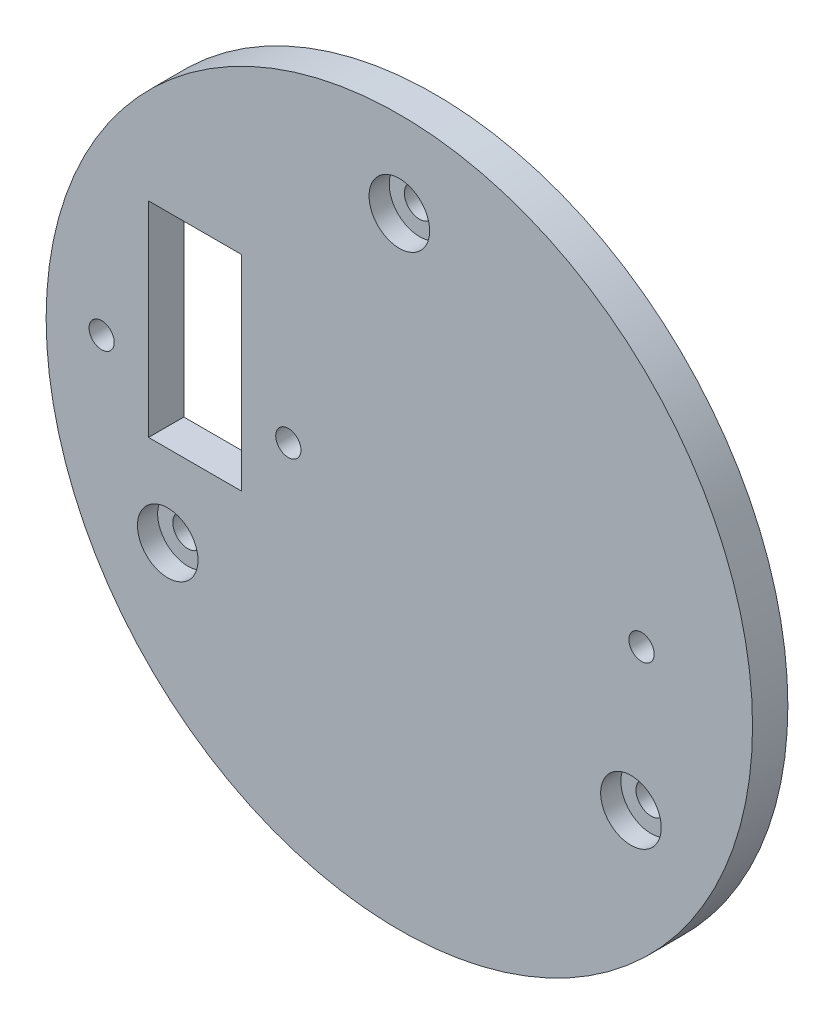
ISO-10303-21;
HEADER;
FILE_DESCRIPTION(('STEP AP214'),'2;1');
FILE_NAME('part.step','',(''),(''),'','','');
FILE_SCHEMA(('AUTOMOTIVE_DESIGN { 1 0 10303 214 1 1 1 1 }'));
ENDSEC;
DATA;
#1=APPLICATION_CONTEXT('core data for automotive mechanical design processes');
#2=APPLICATION_PROTOCOL_DEFINITION('international standard','automotive_design',2000,#1);
#3=PRODUCT_CONTEXT('',#1,'mechanical');
#4=PRODUCT('Part','Part','',(#3));
#5=PRODUCT_RELATED_PRODUCT_CATEGORY('part','',(#4));
#6=PRODUCT_DEFINITION_FORMATION('','',#4);
#7=PRODUCT_DEFINITION_CONTEXT('part definition',#1,'design');
#8=PRODUCT_DEFINITION('design','',#6,#7);
#9=PRODUCT_DEFINITION_SHAPE('','',#8);
#10=(LENGTH_UNIT() NAMED_UNIT(*) SI_UNIT(.MILLI.,.METRE.));
#11=(NAMED_UNIT(*) PLANE_ANGLE_UNIT() SI_UNIT($,.RADIAN.));
#12=(NAMED_UNIT(*) SI_UNIT($,.STERADIAN.) SOLID_ANGLE_UNIT());
#13=UNCERTAINTY_MEASURE_WITH_UNIT(LENGTH_MEASURE(1.E-05),#10,'distance_accuracy_value','');
#14=(GEOMETRIC_REPRESENTATION_CONTEXT(3) GLOBAL_UNCERTAINTY_ASSIGNED_CONTEXT((#13)) GLOBAL_UNIT_ASSIGNED_CONTEXT((#10,
#11,#12)) REPRESENTATION_CONTEXT('',''));
#15=CARTESIAN_POINT('',(0.,0.,0.));
#16=DIRECTION('',(0.,0.,1.));
#17=DIRECTION('',(1.,0.,0.));
#18=AXIS2_PLACEMENT_3D('',#15,#16,#17);
#19=CARTESIAN_POINT('',(0.,0.,3.5));
#20=DIRECTION('',(0.,0.,-1.));
#21=DIRECTION('',(-1.,0.,0.));
#22=AXIS2_PLACEMENT_3D('',#19,#20,#21);
#23=CYLINDRICAL_SURFACE('',#22,35.);
#24=CARTESIAN_POINT('',(0.,0.,3.5));
#25=DIRECTION('',(0.,0.,1.));
#26=DIRECTION('',(1.,0.,0.));
#27=AXIS2_PLACEMENT_3D('',#24,#25,#26);
#28=CIRCLE('',#27,35.);
#29=CARTESIAN_POINT('',(35.,0.,3.5));
#30=VERTEX_POINT('',#29);
#31=EDGE_CURVE('E11',#30,#30,#28,.T.);
#32=ORIENTED_EDGE('',*,*,#31,.F.);
#33=EDGE_LOOP('',(#32));
#34=FACE_BOUND('',#33,.T.);
#35=CARTESIAN_POINT('',(0.,0.,0.));
#36=DIRECTION('',(0.,0.,1.));
#37=DIRECTION('',(1.,0.,0.));
#38=AXIS2_PLACEMENT_3D('',#35,#36,#37);
#39=CIRCLE('',#38,35.);
#40=CARTESIAN_POINT('',(35.,0.,0.));
#41=VERTEX_POINT('',#40);
#42=EDGE_CURVE('E46',#41,#41,#39,.T.);
#43=ORIENTED_EDGE('',*,*,#42,.T.);
#44=EDGE_LOOP('',(#43));
#45=FACE_BOUND('',#44,.T.);
#46=ADVANCED_FACE('F38',(#34,#45),#23,.T.);
#47=CARTESIAN_POINT('',(0.,0.,3.5));
#48=DIRECTION('',(0.,0.,1.));
#49=DIRECTION('',(1.,0.,0.));
#50=AXIS2_PLACEMENT_3D('',#47,#48,#49);
#51=PLANE('',#50);
#52=DIRECTION('',(0.,1.,0.));
#53=VECTOR('',#52,1.);
#54=CARTESIAN_POINT('',(-15.65,0.,3.5));
#55=LINE('',#54,#53);
#56=CARTESIAN_POINT('',(-15.65,-5.15,3.5));
#57=VERTEX_POINT('',#56);
#58=CARTESIAN_POINT('',(-15.65,15.15,3.5));
#59=VERTEX_POINT('',#58);
#60=EDGE_CURVE('E113',#57,#59,#55,.T.);
#61=ORIENTED_EDGE('',*,*,#60,.F.);
#62=DIRECTION('',(1.,0.,0.));
#63=VECTOR('',#62,1.);
#64=CARTESIAN_POINT('',(0.,-5.15,3.5));
#65=LINE('',#64,#63);
#66=CARTESIAN_POINT('',(-24.85,-5.15,3.5));
#67=VERTEX_POINT('',#66);
#68=EDGE_CURVE('E106',#67,#57,#65,.T.);
#69=ORIENTED_EDGE('',*,*,#68,.F.);
#70=DIRECTION('',(0.,-1.,0.));
#71=VECTOR('',#70,1.);
#72=CARTESIAN_POINT('',(-24.85,0.,3.5));
#73=LINE('',#72,#71);
#74=CARTESIAN_POINT('',(-24.85,15.15,3.5));
#75=VERTEX_POINT('',#74);
#76=EDGE_CURVE('E86',#75,#67,#73,.T.);
#77=ORIENTED_EDGE('',*,*,#76,.F.);
#78=DIRECTION('',(-1.,0.,0.));
#79=VECTOR('',#78,1.);
#80=CARTESIAN_POINT('',(0.,15.15,3.5));
#81=LINE('',#80,#79);
#82=EDGE_CURVE('E111',#59,#75,#81,.T.);
#83=ORIENTED_EDGE('',*,*,#82,.F.);
#84=EDGE_LOOP('',(#61,#69,#77,#83));
#85=FACE_BOUND('',#84,.T.);
#86=CARTESIAN_POINT('',(24.,1.29999999999999,3.5));
#87=DIRECTION('',(0.,0.,-1.));
#88=DIRECTION('',(-1.,0.,0.));
#89=AXIS2_PLACEMENT_3D('',#86,#87,#88);
#90=CIRCLE('',#89,1.25);
#91=CARTESIAN_POINT('',(22.75,1.29999999999999,3.5));
#92=VERTEX_POINT('',#91);
#93=EDGE_CURVE('E116',#92,#92,#90,.T.);
#94=ORIENTED_EDGE('',*,*,#93,.T.);
#95=EDGE_LOOP('',(#94));
#96=FACE_BOUND('',#95,.T.);
#97=CARTESIAN_POINT('',(-11.,1.3,3.5));
#98=DIRECTION('',(0.,0.,-1.));
#99=DIRECTION('',(-1.,0.,0.));
#100=AXIS2_PLACEMENT_3D('',#97,#98,#99);
#101=CIRCLE('',#100,1.25);
#102=CARTESIAN_POINT('',(-12.25,1.3,3.5));
#103=VERTEX_POINT('',#102);
#104=EDGE_CURVE('E123',#103,#103,#101,.T.);
#105=ORIENTED_EDGE('',*,*,#104,.T.);
#106=EDGE_LOOP('',(#105));
#107=FACE_BOUND('',#106,.T.);
#108=CARTESIAN_POINT('',(-29.5,1.3,3.5));
#109=DIRECTION('',(0.,0.,-1.));
#110=DIRECTION('',(-1.,0.,0.));
#111=AXIS2_PLACEMENT_3D('',#108,#109,#110);
#112=CIRCLE('',#111,1.25);
#113=CARTESIAN_POINT('',(-30.75,1.3,3.5));
#114=VERTEX_POINT('',#113);
#115=EDGE_CURVE('E129',#114,#114,#112,.T.);
#116=ORIENTED_EDGE('',*,*,#115,.T.);
#117=EDGE_LOOP('',(#116));
#118=FACE_BOUND('',#117,.T.);
#119=CARTESIAN_POINT('',(0.,26.5,3.5));
#120=DIRECTION('',(0.,0.,1.));
#121=DIRECTION('',(1.,0.,0.));
#122=AXIS2_PLACEMENT_3D('',#119,#120,#121);
#123=CIRCLE('',#122,3.);
#124=CARTESIAN_POINT('',(3.,26.5,3.5));
#125=VERTEX_POINT('',#124);
#126=EDGE_CURVE('E146',#125,#125,#123,.T.);
#127=ORIENTED_EDGE('',*,*,#126,.F.);
#128=EDGE_LOOP('',(#127));
#129=FACE_BOUND('',#128,.T.);
#130=CARTESIAN_POINT('',(22.9496732002893,-13.249999999999,3.5));
#131=DIRECTION('',(0.,0.,1.));
#132=DIRECTION('',(1.,0.,0.));
#133=AXIS2_PLACEMENT_3D('',#130,#131,#132);
#134=CIRCLE('',#133,3.00000000000146);
#135=CARTESIAN_POINT('',(25.9496732002908,-13.249999999999,3.5));
#136=VERTEX_POINT('',#135);
#137=EDGE_CURVE('E152',#136,#136,#134,.T.);
#138=ORIENTED_EDGE('',*,*,#137,.F.);
#139=EDGE_LOOP('',(#138));
#140=FACE_BOUND('',#139,.T.);
#141=CARTESIAN_POINT('',(-22.9496732002859,-13.250000000001,3.5));
#142=DIRECTION('',(0.,0.,1.));
#143=DIRECTION('',(1.,0.,0.));
#144=AXIS2_PLACEMENT_3D('',#141,#142,#143);
#145=CIRCLE('',#144,3.00000000000214);
#146=CARTESIAN_POINT('',(-19.9496732002838,-13.250000000001,3.5));
#147=VERTEX_POINT('',#146);
#148=EDGE_CURVE('E158',#147,#147,#145,.T.);
#149=ORIENTED_EDGE('',*,*,#148,.F.);
#150=EDGE_LOOP('',(#149));
#151=FACE_BOUND('',#150,.T.);
#152=ORIENTED_EDGE('',*,*,#31,.T.);
#153=EDGE_LOOP('',(#152));
#154=FACE_BOUND('',#153,.T.);
#155=ADVANCED_FACE('F187',(#85,#96,#107,#118,#129,#140,#151,#154),#51,.T.);
#156=CARTESIAN_POINT('',(0.,0.,0.));
#157=DIRECTION('',(0.,0.,1.));
#158=DIRECTION('',(1.,0.,0.));
#159=AXIS2_PLACEMENT_3D('',#156,#157,#158);
#160=PLANE('',#159);
#161=DIRECTION('',(-1.,0.,0.));
#162=VECTOR('',#161,1.);
#163=CARTESIAN_POINT('',(-15.65,-5.15,0.));
#164=LINE('',#163,#162);
#165=CARTESIAN_POINT('',(-15.65,-5.15,0.));
#166=VERTEX_POINT('',#165);
#167=CARTESIAN_POINT('',(-24.85,-5.15,0.));
#168=VERTEX_POINT('',#167);
#169=EDGE_CURVE('E92',#166,#168,#164,.T.);
#170=ORIENTED_EDGE('',*,*,#169,.F.);
#171=DIRECTION('',(0.,-1.,0.));
#172=VECTOR('',#171,1.);
#173=CARTESIAN_POINT('',(-15.65,15.15,0.));
#174=LINE('',#173,#172);
#175=CARTESIAN_POINT('',(-15.65,15.15,0.));
#176=VERTEX_POINT('',#175);
#177=EDGE_CURVE('E62',#176,#166,#174,.T.);
#178=ORIENTED_EDGE('',*,*,#177,.F.);
#179=DIRECTION('',(1.,0.,0.));
#180=VECTOR('',#179,1.);
#181=CARTESIAN_POINT('',(-15.65,15.15,0.));
#182=LINE('',#181,#180);
#183=CARTESIAN_POINT('',(-24.85,15.15,0.));
#184=VERTEX_POINT('',#183);
#185=EDGE_CURVE('E99',#184,#176,#182,.T.);
#186=ORIENTED_EDGE('',*,*,#185,.F.);
#187=DIRECTION('',(0.,1.,0.));
#188=VECTOR('',#187,1.);
#189=CARTESIAN_POINT('',(-24.85,15.15,0.));
#190=LINE('',#189,#188);
#191=EDGE_CURVE('E83',#168,#184,#190,.T.);
#192=ORIENTED_EDGE('',*,*,#191,.F.);
#193=EDGE_LOOP('',(#170,#178,#186,#192));
#194=FACE_BOUND('',#193,.T.);
#195=CARTESIAN_POINT('',(24.,1.29999999999999,0.));
#196=DIRECTION('',(0.,0.,-1.));
#197=DIRECTION('',(-1.,0.,0.));
#198=AXIS2_PLACEMENT_3D('',#195,#196,#197);
#199=CIRCLE('',#198,1.25);
#200=CARTESIAN_POINT('',(22.75,1.29999999999999,0.));
#201=VERTEX_POINT('',#200);
#202=EDGE_CURVE('E120',#201,#201,#199,.T.);
#203=ORIENTED_EDGE('',*,*,#202,.F.);
#204=EDGE_LOOP('',(#203));
#205=FACE_BOUND('',#204,.T.);
#206=CARTESIAN_POINT('',(-11.,1.3,0.));
#207=DIRECTION('',(0.,0.,-1.));
#208=DIRECTION('',(-1.,0.,0.));
#209=AXIS2_PLACEMENT_3D('',#206,#207,#208);
#210=CIRCLE('',#209,1.25);
#211=CARTESIAN_POINT('',(-12.25,1.3,0.));
#212=VERTEX_POINT('',#211);
#213=EDGE_CURVE('E126',#212,#212,#210,.T.);
#214=ORIENTED_EDGE('',*,*,#213,.F.);
#215=EDGE_LOOP('',(#214));
#216=FACE_BOUND('',#215,.T.);
#217=CARTESIAN_POINT('',(-29.5,1.3,0.));
#218=DIRECTION('',(0.,0.,-1.));
#219=DIRECTION('',(-1.,0.,0.));
#220=AXIS2_PLACEMENT_3D('',#217,#218,#219);
#221=CIRCLE('',#220,1.25);
#222=CARTESIAN_POINT('',(-30.75,1.3,0.));
#223=VERTEX_POINT('',#222);
#224=EDGE_CURVE('E115',#223,#223,#221,.T.);
#225=ORIENTED_EDGE('',*,*,#224,.F.);
#226=EDGE_LOOP('',(#225));
#227=FACE_BOUND('',#226,.T.);
#228=CARTESIAN_POINT('',(0.,26.5,0.));
#229=DIRECTION('',(0.,0.,1.));
#230=DIRECTION('',(1.,0.,0.));
#231=AXIS2_PLACEMENT_3D('',#228,#229,#230);
#232=CIRCLE('',#231,1.5);
#233=CARTESIAN_POINT('',(1.5,26.5,0.));
#234=VERTEX_POINT('',#233);
#235=EDGE_CURVE('E134',#234,#234,#232,.T.);
#236=ORIENTED_EDGE('',*,*,#235,.T.);
#237=EDGE_LOOP('',(#236));
#238=FACE_BOUND('',#237,.T.);
#239=CARTESIAN_POINT('',(-22.9496732002859,-13.250000000001,0.));
#240=DIRECTION('',(0.,0.,1.));
#241=DIRECTION('',(1.,0.,0.));
#242=AXIS2_PLACEMENT_3D('',#239,#240,#241);
#243=CIRCLE('',#242,1.50000000000214);
#244=CARTESIAN_POINT('',(-21.4496732002838,-13.250000000001,0.));
#245=VERTEX_POINT('',#244);
#246=EDGE_CURVE('E138',#245,#245,#243,.T.);
#247=ORIENTED_EDGE('',*,*,#246,.T.);
#248=EDGE_LOOP('',(#247));
#249=FACE_BOUND('',#248,.T.);
#250=CARTESIAN_POINT('',(22.9496732002893,-13.249999999999,0.));
#251=DIRECTION('',(0.,0.,1.));
#252=DIRECTION('',(1.,0.,0.));
#253=AXIS2_PLACEMENT_3D('',#250,#251,#252);
#254=CIRCLE('',#253,1.50000000000146);
#255=CARTESIAN_POINT('',(24.4496732002908,-13.249999999999,0.));
#256=VERTEX_POINT('',#255);
#257=EDGE_CURVE('E119',#256,#256,#254,.T.);
#258=ORIENTED_EDGE('',*,*,#257,.T.);
#259=EDGE_LOOP('',(#258));
#260=FACE_BOUND('',#259,.T.);
#261=ORIENTED_EDGE('',*,*,#42,.F.);
#262=EDGE_LOOP('',(#261));
#263=FACE_BOUND('',#262,.T.);
#264=ADVANCED_FACE('F96',(#194,#205,#216,#227,#238,#249,#260,#263),#160,.F.);
#265=CARTESIAN_POINT('',(-22.9496732002859,-13.250000000001,1.5));
#266=DIRECTION('',(0.,0.,1.));
#267=DIRECTION('',(1.,0.,0.));
#268=AXIS2_PLACEMENT_3D('',#265,#266,#267);
#269=CYLINDRICAL_SURFACE('',#268,3.00000000000214);
#270=CARTESIAN_POINT('',(-22.9496732002859,-13.250000000001,1.5));
#271=DIRECTION('',(0.,0.,1.));
#272=DIRECTION('',(1.,0.,0.));
#273=AXIS2_PLACEMENT_3D('',#270,#271,#272);
#274=CIRCLE('',#273,3.00000000000214);
#275=CARTESIAN_POINT('',(-19.9496732002838,-13.250000000001,1.5));
#276=VERTEX_POINT('',#275);
#277=EDGE_CURVE('E155',#276,#276,#274,.T.);
#278=ORIENTED_EDGE('',*,*,#277,.F.);
#279=EDGE_LOOP('',(#278));
#280=FACE_BOUND('',#279,.T.);
#281=ORIENTED_EDGE('',*,*,#148,.T.);
#282=EDGE_LOOP('',(#281));
#283=FACE_BOUND('',#282,.T.);
#284=ADVANCED_FACE('F178',(#280,#283),#269,.F.);
#285=CARTESIAN_POINT('',(-22.9496732002859,-13.250000000001,1.5));
#286=DIRECTION('',(0.,0.,1.));
#287=DIRECTION('',(1.,0.,0.));
#288=AXIS2_PLACEMENT_3D('',#285,#286,#287);
#289=PLANE('',#288);
#290=CARTESIAN_POINT('',(-22.9496732002859,-13.250000000001,1.5));
#291=DIRECTION('',(0.,0.,1.));
#292=DIRECTION('',(1.,0.,0.));
#293=AXIS2_PLACEMENT_3D('',#290,#291,#292);
#294=CIRCLE('',#293,1.50000000000214);
#295=CARTESIAN_POINT('',(-21.4496732002838,-13.250000000001,1.5));
#296=VERTEX_POINT('',#295);
#297=EDGE_CURVE('E41',#296,#296,#294,.T.);
#298=ORIENTED_EDGE('',*,*,#297,.F.);
#299=EDGE_LOOP('',(#298));
#300=FACE_BOUND('',#299,.T.);
#301=ORIENTED_EDGE('',*,*,#277,.T.);
#302=EDGE_LOOP('',(#301));
#303=FACE_BOUND('',#302,.T.);
#304=ADVANCED_FACE('F174',(#300,#303),#289,.T.);
#305=CARTESIAN_POINT('',(22.9496732002893,-13.249999999999,1.5));
#306=DIRECTION('',(0.,0.,1.));
#307=DIRECTION('',(1.,0.,0.));
#308=AXIS2_PLACEMENT_3D('',#305,#306,#307);
#309=CYLINDRICAL_SURFACE('',#308,3.00000000000146);
#310=CARTESIAN_POINT('',(22.9496732002893,-13.249999999999,1.5));
#311=DIRECTION('',(0.,0.,1.));
#312=DIRECTION('',(1.,0.,0.));
#313=AXIS2_PLACEMENT_3D('',#310,#311,#312);
#314=CIRCLE('',#313,3.00000000000146);
#315=CARTESIAN_POINT('',(25.9496732002908,-13.249999999999,1.5));
#316=VERTEX_POINT('',#315);
#317=EDGE_CURVE('E149',#316,#316,#314,.T.);
#318=ORIENTED_EDGE('',*,*,#317,.F.);
#319=EDGE_LOOP('',(#318));
#320=FACE_BOUND('',#319,.T.);
#321=ORIENTED_EDGE('',*,*,#137,.T.);
#322=EDGE_LOOP('',(#321));
#323=FACE_BOUND('',#322,.T.);
#324=ADVANCED_FACE('F177',(#320,#323),#309,.F.);
#325=CARTESIAN_POINT('',(22.9496732002893,-13.249999999999,1.5));
#326=DIRECTION('',(0.,0.,1.));
#327=DIRECTION('',(1.,0.,0.));
#328=AXIS2_PLACEMENT_3D('',#325,#326,#327);
#329=PLANE('',#328);
#330=CARTESIAN_POINT('',(22.9496732002893,-13.249999999999,1.5));
#331=DIRECTION('',(0.,0.,1.));
#332=DIRECTION('',(1.,0.,0.));
#333=AXIS2_PLACEMENT_3D('',#330,#331,#332);
#334=CIRCLE('',#333,1.50000000000146);
#335=CARTESIAN_POINT('',(24.4496732002908,-13.249999999999,1.5));
#336=VERTEX_POINT('',#335);
#337=EDGE_CURVE('E164',#336,#336,#334,.T.);
#338=ORIENTED_EDGE('',*,*,#337,.F.);
#339=EDGE_LOOP('',(#338));
#340=FACE_BOUND('',#339,.T.);
#341=ORIENTED_EDGE('',*,*,#317,.T.);
#342=EDGE_LOOP('',(#341));
#343=FACE_BOUND('',#342,.T.);
#344=ADVANCED_FACE('F204',(#340,#343),#329,.T.);
#345=CARTESIAN_POINT('',(0.,26.5,1.5));
#346=DIRECTION('',(0.,0.,1.));
#347=DIRECTION('',(1.,0.,0.));
#348=AXIS2_PLACEMENT_3D('',#345,#346,#347);
#349=CYLINDRICAL_SURFACE('',#348,3.);
#350=CARTESIAN_POINT('',(0.,26.5,1.5));
#351=DIRECTION('',(0.,0.,1.));
#352=DIRECTION('',(1.,0.,0.));
#353=AXIS2_PLACEMENT_3D('',#350,#351,#352);
#354=CIRCLE('',#353,3.);
#355=CARTESIAN_POINT('',(3.,26.5,1.5));
#356=VERTEX_POINT('',#355);
#357=EDGE_CURVE('E143',#356,#356,#354,.T.);
#358=ORIENTED_EDGE('',*,*,#357,.F.);
#359=EDGE_LOOP('',(#358));
#360=FACE_BOUND('',#359,.T.);
#361=ORIENTED_EDGE('',*,*,#126,.T.);
#362=EDGE_LOOP('',(#361));
#363=FACE_BOUND('',#362,.T.);
#364=ADVANCED_FACE('F208',(#360,#363),#349,.F.);
#365=CARTESIAN_POINT('',(0.,26.5,1.5));
#366=DIRECTION('',(0.,0.,1.));
#367=DIRECTION('',(1.,0.,0.));
#368=AXIS2_PLACEMENT_3D('',#365,#366,#367);
#369=PLANE('',#368);
#370=CARTESIAN_POINT('',(0.,26.5,1.5));
#371=DIRECTION('',(0.,0.,1.));
#372=DIRECTION('',(1.,0.,0.));
#373=AXIS2_PLACEMENT_3D('',#370,#371,#372);
#374=CIRCLE('',#373,1.5);
#375=CARTESIAN_POINT('',(1.5,26.5,1.5));
#376=VERTEX_POINT('',#375);
#377=EDGE_CURVE('E137',#376,#376,#374,.T.);
#378=ORIENTED_EDGE('',*,*,#377,.F.);
#379=EDGE_LOOP('',(#378));
#380=FACE_BOUND('',#379,.T.);
#381=ORIENTED_EDGE('',*,*,#357,.T.);
#382=EDGE_LOOP('',(#381));
#383=FACE_BOUND('',#382,.T.);
#384=ADVANCED_FACE('F212',(#380,#383),#369,.T.);
#385=CARTESIAN_POINT('',(0.,26.5,0.));
#386=DIRECTION('',(0.,0.,1.));
#387=DIRECTION('',(1.,0.,0.));
#388=AXIS2_PLACEMENT_3D('',#385,#386,#387);
#389=CYLINDRICAL_SURFACE('',#388,1.5);
#390=ORIENTED_EDGE('',*,*,#377,.T.);
#391=EDGE_LOOP('',(#390));
#392=FACE_BOUND('',#391,.T.);
#393=ORIENTED_EDGE('',*,*,#235,.F.);
#394=EDGE_LOOP('',(#393));
#395=FACE_BOUND('',#394,.T.);
#396=ADVANCED_FACE('F216',(#392,#395),#389,.F.);
#397=CARTESIAN_POINT('',(22.9496732002893,-13.249999999999,0.));
#398=DIRECTION('',(0.,0.,1.));
#399=DIRECTION('',(1.,0.,0.));
#400=AXIS2_PLACEMENT_3D('',#397,#398,#399);
#401=CYLINDRICAL_SURFACE('',#400,1.50000000000146);
#402=ORIENTED_EDGE('',*,*,#337,.T.);
#403=EDGE_LOOP('',(#402));
#404=FACE_BOUND('',#403,.T.);
#405=ORIENTED_EDGE('',*,*,#257,.F.);
#406=EDGE_LOOP('',(#405));
#407=FACE_BOUND('',#406,.T.);
#408=ADVANCED_FACE('F218',(#404,#407),#401,.F.);
#409=CARTESIAN_POINT('',(-22.9496732002859,-13.250000000001,0.));
#410=DIRECTION('',(0.,0.,1.));
#411=DIRECTION('',(1.,0.,0.));
#412=AXIS2_PLACEMENT_3D('',#409,#410,#411);
#413=CYLINDRICAL_SURFACE('',#412,1.50000000000214);
#414=ORIENTED_EDGE('',*,*,#297,.T.);
#415=EDGE_LOOP('',(#414));
#416=FACE_BOUND('',#415,.T.);
#417=ORIENTED_EDGE('',*,*,#246,.F.);
#418=EDGE_LOOP('',(#417));
#419=FACE_BOUND('',#418,.T.);
#420=ADVANCED_FACE('F171',(#416,#419),#413,.F.);
#421=CARTESIAN_POINT('',(-29.5,1.3,3.5));
#422=DIRECTION('',(0.,0.,-1.));
#423=DIRECTION('',(-1.,0.,0.));
#424=AXIS2_PLACEMENT_3D('',#421,#422,#423);
#425=CYLINDRICAL_SURFACE('',#424,1.25);
#426=ORIENTED_EDGE('',*,*,#115,.F.);
#427=EDGE_LOOP('',(#426));
#428=FACE_BOUND('',#427,.T.);
#429=ORIENTED_EDGE('',*,*,#224,.T.);
#430=EDGE_LOOP('',(#429));
#431=FACE_BOUND('',#430,.T.);
#432=ADVANCED_FACE('F223',(#428,#431),#425,.F.);
#433=CARTESIAN_POINT('',(-11.,1.3,3.5));
#434=DIRECTION('',(0.,0.,-1.));
#435=DIRECTION('',(-1.,0.,0.));
#436=AXIS2_PLACEMENT_3D('',#433,#434,#435);
#437=CYLINDRICAL_SURFACE('',#436,1.25);
#438=ORIENTED_EDGE('',*,*,#104,.F.);
#439=EDGE_LOOP('',(#438));
#440=FACE_BOUND('',#439,.T.);
#441=ORIENTED_EDGE('',*,*,#213,.T.);
#442=EDGE_LOOP('',(#441));
#443=FACE_BOUND('',#442,.T.);
#444=ADVANCED_FACE('F229',(#440,#443),#437,.F.);
#445=CARTESIAN_POINT('',(24.,1.29999999999999,3.5));
#446=DIRECTION('',(0.,0.,-1.));
#447=DIRECTION('',(-1.,0.,0.));
#448=AXIS2_PLACEMENT_3D('',#445,#446,#447);
#449=CYLINDRICAL_SURFACE('',#448,1.25);
#450=ORIENTED_EDGE('',*,*,#93,.F.);
#451=EDGE_LOOP('',(#450));
#452=FACE_BOUND('',#451,.T.);
#453=ORIENTED_EDGE('',*,*,#202,.T.);
#454=EDGE_LOOP('',(#453));
#455=FACE_BOUND('',#454,.T.);
#456=ADVANCED_FACE('F233',(#452,#455),#449,.F.);
#457=CARTESIAN_POINT('',(-15.65,15.15,10.));
#458=DIRECTION('',(1.,0.,0.));
#459=DIRECTION('',(0.,0.,-1.));
#460=AXIS2_PLACEMENT_3D('',#457,#458,#459);
#461=PLANE('',#460);
#462=ORIENTED_EDGE('',*,*,#60,.T.);
#463=DIRECTION('',(0.,0.,-1.));
#464=VECTOR('',#463,1.);
#465=CARTESIAN_POINT('',(-15.65,15.15,10.));
#466=LINE('',#465,#464);
#467=EDGE_CURVE('E104',#59,#176,#466,.T.);
#468=ORIENTED_EDGE('',*,*,#467,.T.);
#469=ORIENTED_EDGE('',*,*,#177,.T.);
#470=DIRECTION('',(0.,0.,-1.));
#471=VECTOR('',#470,1.);
#472=CARTESIAN_POINT('',(-15.65,-5.15,10.));
#473=LINE('',#472,#471);
#474=EDGE_CURVE('E89',#57,#166,#473,.T.);
#475=ORIENTED_EDGE('',*,*,#474,.F.);
#476=EDGE_LOOP('',(#462,#468,#469,#475));
#477=FACE_BOUND('',#476,.T.);
#478=ADVANCED_FACE('F237',(#477),#461,.F.);
#479=CARTESIAN_POINT('',(-15.65,15.15,10.));
#480=DIRECTION('',(0.,1.,0.));
#481=DIRECTION('',(-1.,0.,0.));
#482=AXIS2_PLACEMENT_3D('',#479,#480,#481);
#483=PLANE('',#482);
#484=ORIENTED_EDGE('',*,*,#82,.T.);
#485=DIRECTION('',(0.,0.,-1.));
#486=VECTOR('',#485,1.);
#487=CARTESIAN_POINT('',(-24.85,15.15,10.));
#488=LINE('',#487,#486);
#489=EDGE_CURVE('E88',#75,#184,#488,.T.);
#490=ORIENTED_EDGE('',*,*,#489,.T.);
#491=ORIENTED_EDGE('',*,*,#185,.T.);
#492=ORIENTED_EDGE('',*,*,#467,.F.);
#493=EDGE_LOOP('',(#484,#490,#491,#492));
#494=FACE_BOUND('',#493,.T.);
#495=ADVANCED_FACE('F241',(#494),#483,.F.);
#496=CARTESIAN_POINT('',(-24.85,15.15,10.));
#497=DIRECTION('',(-1.,0.,0.));
#498=DIRECTION('',(0.,0.,1.));
#499=AXIS2_PLACEMENT_3D('',#496,#497,#498);
#500=PLANE('',#499);
#501=ORIENTED_EDGE('',*,*,#76,.T.);
#502=DIRECTION('',(0.,0.,-1.));
#503=VECTOR('',#502,1.);
#504=CARTESIAN_POINT('',(-24.85,-5.15,10.));
#505=LINE('',#504,#503);
#506=EDGE_CURVE('E54',#67,#168,#505,.T.);
#507=ORIENTED_EDGE('',*,*,#506,.T.);
#508=ORIENTED_EDGE('',*,*,#191,.T.);
#509=ORIENTED_EDGE('',*,*,#489,.F.);
#510=EDGE_LOOP('',(#501,#507,#508,#509));
#511=FACE_BOUND('',#510,.T.);
#512=ADVANCED_FACE('F80',(#511),#500,.F.);
#513=CARTESIAN_POINT('',(-15.65,-5.15,10.));
#514=DIRECTION('',(0.,-1.,0.));
#515=DIRECTION('',(1.,0.,0.));
#516=AXIS2_PLACEMENT_3D('',#513,#514,#515);
#517=PLANE('',#516);
#518=ORIENTED_EDGE('',*,*,#68,.T.);
#519=ORIENTED_EDGE('',*,*,#474,.T.);
#520=ORIENTED_EDGE('',*,*,#169,.T.);
#521=ORIENTED_EDGE('',*,*,#506,.F.);
#522=EDGE_LOOP('',(#518,#519,#520,#521));
#523=FACE_BOUND('',#522,.T.);
#524=ADVANCED_FACE('F93',(#523),#517,.F.);
#525=CLOSED_SHELL('',(#46,#155,#264,#284,#304,#324,#344,#364,#384,#396,#408,#420,#432,#444,#456,
#478,#495,#512,#524));
#526=MANIFOLD_SOLID_BREP('B2',#525);
#527=ADVANCED_BREP_SHAPE_REPRESENTATION('',(#18,#526),#14);
#528=SHAPE_DEFINITION_REPRESENTATION(#9,#527);
ENDSEC;
END-ISO-10303-21;
